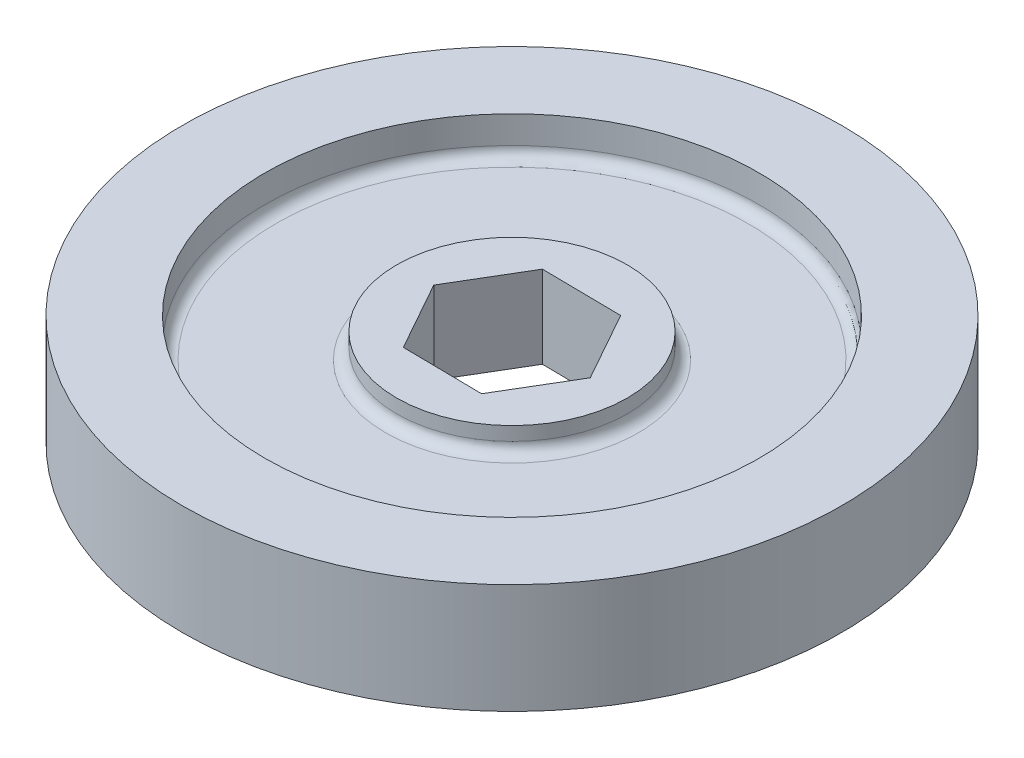
ISO-10303-21;
HEADER;
FILE_DESCRIPTION(('STEP AP214'),'2;1');
FILE_NAME('part.step','',(''),(''),'','','');
FILE_SCHEMA(('AUTOMOTIVE_DESIGN { 1 0 10303 214 1 1 1 1 }'));
ENDSEC;
DATA;
#1=APPLICATION_CONTEXT('core data for automotive mechanical design processes');
#2=APPLICATION_PROTOCOL_DEFINITION('international standard','automotive_design',2000,#1);
#3=PRODUCT_CONTEXT('',#1,'mechanical');
#4=PRODUCT('Part','Part','',(#3));
#5=PRODUCT_RELATED_PRODUCT_CATEGORY('part','',(#4));
#6=PRODUCT_DEFINITION_FORMATION('','',#4);
#7=PRODUCT_DEFINITION_CONTEXT('part definition',#1,'design');
#8=PRODUCT_DEFINITION('design','',#6,#7);
#9=PRODUCT_DEFINITION_SHAPE('','',#8);
#10=(LENGTH_UNIT() NAMED_UNIT(*) SI_UNIT(.MILLI.,.METRE.));
#11=(NAMED_UNIT(*) PLANE_ANGLE_UNIT() SI_UNIT($,.RADIAN.));
#12=(NAMED_UNIT(*) SI_UNIT($,.STERADIAN.) SOLID_ANGLE_UNIT());
#13=UNCERTAINTY_MEASURE_WITH_UNIT(LENGTH_MEASURE(1.E-05),#10,'distance_accuracy_value','');
#14=(GEOMETRIC_REPRESENTATION_CONTEXT(3) GLOBAL_UNCERTAINTY_ASSIGNED_CONTEXT((#13)) GLOBAL_UNIT_ASSIGNED_CONTEXT((#10,
#11,#12)) REPRESENTATION_CONTEXT('',''));
#15=CARTESIAN_POINT('',(0.,0.,0.));
#16=DIRECTION('',(0.,0.,1.));
#17=DIRECTION('',(1.,0.,0.));
#18=AXIS2_PLACEMENT_3D('',#15,#16,#17);
#19=CARTESIAN_POINT('',(0.,10.,0.));
#20=DIRECTION('',(0.,-1.,0.));
#21=DIRECTION('',(0.,0.,-1.));
#22=AXIS2_PLACEMENT_3D('',#19,#20,#21);
#23=CYLINDRICAL_SURFACE('',#22,30.);
#24=CARTESIAN_POINT('',(0.,10.,0.));
#25=DIRECTION('',(0.,1.,0.));
#26=DIRECTION('',(0.,0.,1.));
#27=AXIS2_PLACEMENT_3D('',#24,#25,#26);
#28=CIRCLE('',#27,30.);
#29=CARTESIAN_POINT('',(0.,10.,30.));
#30=VERTEX_POINT('',#29);
#31=EDGE_CURVE('E128',#30,#30,#28,.T.);
#32=ORIENTED_EDGE('',*,*,#31,.F.);
#33=EDGE_LOOP('',(#32));
#34=FACE_BOUND('',#33,.T.);
#35=CARTESIAN_POINT('',(0.,0.,0.));
#36=DIRECTION('',(0.,1.,0.));
#37=DIRECTION('',(0.,0.,1.));
#38=AXIS2_PLACEMENT_3D('',#35,#36,#37);
#39=CIRCLE('',#38,30.);
#40=CARTESIAN_POINT('',(0.,0.,30.));
#41=VERTEX_POINT('',#40);
#42=EDGE_CURVE('E127',#41,#41,#39,.T.);
#43=ORIENTED_EDGE('',*,*,#42,.T.);
#44=EDGE_LOOP('',(#43));
#45=FACE_BOUND('',#44,.T.);
#46=ADVANCED_FACE('F33',(#34,#45),#23,.T.);
#47=CARTESIAN_POINT('',(0.,10.,0.));
#48=DIRECTION('',(0.,1.,0.));
#49=DIRECTION('',(0.,0.,1.));
#50=AXIS2_PLACEMENT_3D('',#47,#48,#49);
#51=PLANE('',#50);
#52=CARTESIAN_POINT('',(0.,10.,0.));
#53=DIRECTION('',(0.,1.,0.));
#54=DIRECTION('',(0.,0.,1.));
#55=AXIS2_PLACEMENT_3D('',#52,#53,#54);
#56=CIRCLE('',#55,22.5);
#57=CARTESIAN_POINT('',(0.,10.,22.5));
#58=VERTEX_POINT('',#57);
#59=EDGE_CURVE('E124',#58,#58,#56,.T.);
#60=ORIENTED_EDGE('',*,*,#59,.F.);
#61=EDGE_LOOP('',(#60));
#62=FACE_BOUND('',#61,.T.);
#63=ORIENTED_EDGE('',*,*,#31,.T.);
#64=EDGE_LOOP('',(#63));
#65=FACE_BOUND('',#64,.T.);
#66=ADVANCED_FACE('F177',(#62,#65),#51,.T.);
#67=CARTESIAN_POINT('',(0.,0.,0.));
#68=DIRECTION('',(0.,1.,0.));
#69=DIRECTION('',(0.,0.,1.));
#70=AXIS2_PLACEMENT_3D('',#67,#68,#69);
#71=PLANE('',#70);
#72=CARTESIAN_POINT('',(0.,0.,0.));
#73=DIRECTION('',(0.,-1.,0.));
#74=DIRECTION('',(0.,0.,-1.));
#75=AXIS2_PLACEMENT_3D('',#72,#73,#74);
#76=CIRCLE('',#75,22.5);
#77=CARTESIAN_POINT('',(0.,0.,-22.5));
#78=VERTEX_POINT('',#77);
#79=EDGE_CURVE('E121',#78,#78,#76,.T.);
#80=ORIENTED_EDGE('',*,*,#79,.F.);
#81=EDGE_LOOP('',(#80));
#82=FACE_BOUND('',#81,.T.);
#83=ORIENTED_EDGE('',*,*,#42,.F.);
#84=EDGE_LOOP('',(#83));
#85=FACE_BOUND('',#84,.T.);
#86=ADVANCED_FACE('F183',(#82,#85),#71,.F.);
#87=CARTESIAN_POINT('',(0.,6.5,0.));
#88=DIRECTION('',(0.,1.,0.));
#89=DIRECTION('',(0.,0.,1.));
#90=AXIS2_PLACEMENT_3D('',#87,#88,#89);
#91=CYLINDRICAL_SURFACE('',#90,22.5);
#92=CARTESIAN_POINT('',(0.,7.5,0.));
#93=DIRECTION('',(0.,1.,0.));
#94=DIRECTION('',(0.,0.,1.));
#95=AXIS2_PLACEMENT_3D('',#92,#93,#94);
#96=CIRCLE('',#95,22.5);
#97=CARTESIAN_POINT('',(0.,7.5,22.5));
#98=VERTEX_POINT('',#97);
#99=EDGE_CURVE('E153',#98,#98,#96,.F.);
#100=ORIENTED_EDGE('',*,*,#99,.T.);
#101=EDGE_LOOP('',(#100));
#102=FACE_BOUND('',#101,.T.);
#103=ORIENTED_EDGE('',*,*,#59,.T.);
#104=EDGE_LOOP('',(#103));
#105=FACE_BOUND('',#104,.T.);
#106=ADVANCED_FACE('F205',(#102,#105),#91,.F.);
#107=CARTESIAN_POINT('',(0.,6.5,0.));
#108=DIRECTION('',(0.,1.,0.));
#109=DIRECTION('',(0.,0.,1.));
#110=AXIS2_PLACEMENT_3D('',#107,#108,#109);
#111=PLANE('',#110);
#112=CARTESIAN_POINT('',(0.,6.5,0.));
#113=DIRECTION('',(0.,1.,0.));
#114=DIRECTION('',(0.,0.,1.));
#115=AXIS2_PLACEMENT_3D('',#112,#113,#114);
#116=CIRCLE('',#115,11.5);
#117=CARTESIAN_POINT('',(0.,6.5,11.5));
#118=VERTEX_POINT('',#117);
#119=EDGE_CURVE('E11',#118,#118,#116,.F.);
#120=ORIENTED_EDGE('',*,*,#119,.T.);
#121=EDGE_LOOP('',(#120));
#122=FACE_BOUND('',#121,.T.);
#123=CARTESIAN_POINT('',(0.,6.5,0.));
#124=DIRECTION('',(0.,1.,0.));
#125=DIRECTION('',(0.,0.,1.));
#126=AXIS2_PLACEMENT_3D('',#123,#124,#125);
#127=CIRCLE('',#126,21.5);
#128=CARTESIAN_POINT('',(0.,6.5,21.5));
#129=VERTEX_POINT('',#128);
#130=EDGE_CURVE('E150',#129,#129,#127,.T.);
#131=ORIENTED_EDGE('',*,*,#130,.T.);
#132=EDGE_LOOP('',(#131));
#133=FACE_BOUND('',#132,.T.);
#134=ADVANCED_FACE('F202',(#122,#133),#111,.T.);
#135=CARTESIAN_POINT('',(0.,3.5,0.));
#136=DIRECTION('',(0.,-1.,0.));
#137=DIRECTION('',(0.,0.,-1.));
#138=AXIS2_PLACEMENT_3D('',#135,#136,#137);
#139=CYLINDRICAL_SURFACE('',#138,22.5);
#140=CARTESIAN_POINT('',(0.,2.5,0.));
#141=DIRECTION('',(0.,-1.,0.));
#142=DIRECTION('',(0.,0.,-1.));
#143=AXIS2_PLACEMENT_3D('',#140,#141,#142);
#144=CIRCLE('',#143,22.5);
#145=CARTESIAN_POINT('',(0.,2.5,-22.5));
#146=VERTEX_POINT('',#145);
#147=EDGE_CURVE('E147',#146,#146,#144,.F.);
#148=ORIENTED_EDGE('',*,*,#147,.T.);
#149=EDGE_LOOP('',(#148));
#150=FACE_BOUND('',#149,.T.);
#151=ORIENTED_EDGE('',*,*,#79,.T.);
#152=EDGE_LOOP('',(#151));
#153=FACE_BOUND('',#152,.T.);
#154=ADVANCED_FACE('F204',(#150,#153),#139,.F.);
#155=CARTESIAN_POINT('',(0.,3.5,0.));
#156=DIRECTION('',(0.,-1.,0.));
#157=DIRECTION('',(0.,0.,-1.));
#158=AXIS2_PLACEMENT_3D('',#155,#156,#157);
#159=PLANE('',#158);
#160=CARTESIAN_POINT('',(0.,3.5,0.));
#161=DIRECTION('',(0.,-1.,0.));
#162=DIRECTION('',(0.,0.,-1.));
#163=AXIS2_PLACEMENT_3D('',#160,#161,#162);
#164=CIRCLE('',#163,11.5);
#165=CARTESIAN_POINT('',(0.,3.5,-11.5));
#166=VERTEX_POINT('',#165);
#167=EDGE_CURVE('E159',#166,#166,#164,.F.);
#168=ORIENTED_EDGE('',*,*,#167,.T.);
#169=EDGE_LOOP('',(#168));
#170=FACE_BOUND('',#169,.T.);
#171=CARTESIAN_POINT('',(0.,3.5,0.));
#172=DIRECTION('',(0.,-1.,0.));
#173=DIRECTION('',(0.,0.,-1.));
#174=AXIS2_PLACEMENT_3D('',#171,#172,#173);
#175=CIRCLE('',#174,21.5);
#176=CARTESIAN_POINT('',(0.,3.5,-21.5));
#177=VERTEX_POINT('',#176);
#178=EDGE_CURVE('E144',#177,#177,#175,.T.);
#179=ORIENTED_EDGE('',*,*,#178,.T.);
#180=EDGE_LOOP('',(#179));
#181=FACE_BOUND('',#180,.T.);
#182=ADVANCED_FACE('F212',(#170,#181),#159,.T.);
#183=CARTESIAN_POINT('',(0.,8.75,0.));
#184=DIRECTION('',(0.,-1.,0.));
#185=DIRECTION('',(0.,0.,-1.));
#186=AXIS2_PLACEMENT_3D('',#183,#184,#185);
#187=CYLINDRICAL_SURFACE('',#186,10.5);
#188=CARTESIAN_POINT('',(0.,7.5,0.));
#189=DIRECTION('',(0.,1.,0.));
#190=DIRECTION('',(0.,0.,1.));
#191=AXIS2_PLACEMENT_3D('',#188,#189,#190);
#192=CIRCLE('',#191,10.5);
#193=CARTESIAN_POINT('',(0.,7.5,10.5));
#194=VERTEX_POINT('',#193);
#195=EDGE_CURVE('E41',#194,#194,#192,.T.);
#196=ORIENTED_EDGE('',*,*,#195,.T.);
#197=EDGE_LOOP('',(#196));
#198=FACE_BOUND('',#197,.T.);
#199=CARTESIAN_POINT('',(0.,8.75,0.));
#200=DIRECTION('',(0.,1.,0.));
#201=DIRECTION('',(0.,0.,1.));
#202=AXIS2_PLACEMENT_3D('',#199,#200,#201);
#203=CIRCLE('',#202,10.5);
#204=CARTESIAN_POINT('',(0.,8.75,10.5));
#205=VERTEX_POINT('',#204);
#206=EDGE_CURVE('E118',#205,#205,#203,.T.);
#207=ORIENTED_EDGE('',*,*,#206,.F.);
#208=EDGE_LOOP('',(#207));
#209=FACE_BOUND('',#208,.T.);
#210=ADVANCED_FACE('F164',(#198,#209),#187,.T.);
#211=CARTESIAN_POINT('',(0.,8.75,0.));
#212=DIRECTION('',(0.,1.,0.));
#213=DIRECTION('',(0.,0.,1.));
#214=AXIS2_PLACEMENT_3D('',#211,#212,#213);
#215=PLANE('',#214);
#216=DIRECTION('',(-0.48866357112851,0.,-0.872472299991199));
#217=VECTOR('',#216,1.);
#218=CARTESIAN_POINT('',(5.45295187494499,8.75,-3.05414731955318));
#219=LINE('',#218,#217);
#220=CARTESIAN_POINT('',(7.2162646520338,8.75,0.0941159133243871));
#221=VERTEX_POINT('',#220);
#222=CARTESIAN_POINT('',(3.68963909785619,8.75,-6.20241055243075));
#223=VERTEX_POINT('',#222);
#224=EDGE_CURVE('E113',#221,#223,#219,.T.);
#225=ORIENTED_EDGE('',*,*,#224,.F.);
#226=DIRECTION('',(0.511251390326361,0.,-0.859431216496913));
#227=VECTOR('',#226,1.);
#228=CARTESIAN_POINT('',(5.3714451031057,8.75,3.19532118953976));
#229=LINE('',#228,#227);
#230=CARTESIAN_POINT('',(3.52662555417761,8.75,6.29652646575513));
#231=VERTEX_POINT('',#230);
#232=EDGE_CURVE('E111',#231,#221,#229,.T.);
#233=ORIENTED_EDGE('',*,*,#232,.F.);
#234=DIRECTION('',(0.99991496145487,0.,0.0130410834942862));
#235=VECTOR('',#234,1.);
#236=CARTESIAN_POINT('',(-0.081506771839289,8.75,6.24946850909294));
#237=LINE('',#236,#235);
#238=CARTESIAN_POINT('',(-3.68963909785619,8.75,6.20241055243075));
#239=VERTEX_POINT('',#238);
#240=EDGE_CURVE('E106',#239,#231,#237,.T.);
#241=ORIENTED_EDGE('',*,*,#240,.F.);
#242=DIRECTION('',(0.488663571128509,0.,0.872472299991199));
#243=VECTOR('',#242,1.);
#244=CARTESIAN_POINT('',(-5.45295187494499,8.75,3.05414731955318));
#245=LINE('',#244,#243);
#246=CARTESIAN_POINT('',(-7.2162646520338,8.75,-0.0941159133243836));
#247=VERTEX_POINT('',#246);
#248=EDGE_CURVE('E104',#247,#239,#245,.T.);
#249=ORIENTED_EDGE('',*,*,#248,.F.);
#250=DIRECTION('',(-0.511251390326361,0.,0.859431216496913));
#251=VECTOR('',#250,1.);
#252=CARTESIAN_POINT('',(-5.3714451031057,8.75,-3.19532118953976));
#253=LINE('',#252,#251);
#254=CARTESIAN_POINT('',(-3.52662555417761,8.75,-6.29652646575513));
#255=VERTEX_POINT('',#254);
#256=EDGE_CURVE('E88',#255,#247,#253,.T.);
#257=ORIENTED_EDGE('',*,*,#256,.F.);
#258=DIRECTION('',(-0.99991496145487,0.,-0.0130410834942866));
#259=VECTOR('',#258,1.);
#260=CARTESIAN_POINT('',(0.0815067718392913,8.75,-6.24946850909294));
#261=LINE('',#260,#259);
#262=EDGE_CURVE('E83',#223,#255,#261,.T.);
#263=ORIENTED_EDGE('',*,*,#262,.F.);
#264=EDGE_LOOP('',(#225,#233,#241,#249,#257,#263));
#265=FACE_BOUND('',#264,.T.);
#266=ORIENTED_EDGE('',*,*,#206,.T.);
#267=EDGE_LOOP('',(#266));
#268=FACE_BOUND('',#267,.T.);
#269=ADVANCED_FACE('F101',(#265,#268),#215,.T.);
#270=CARTESIAN_POINT('',(0.,1.25,0.));
#271=DIRECTION('',(0.,1.,0.));
#272=DIRECTION('',(0.,0.,1.));
#273=AXIS2_PLACEMENT_3D('',#270,#271,#272);
#274=CYLINDRICAL_SURFACE('',#273,10.5);
#275=CARTESIAN_POINT('',(0.,2.5,0.));
#276=DIRECTION('',(0.,-1.,0.));
#277=DIRECTION('',(0.,0.,-1.));
#278=AXIS2_PLACEMENT_3D('',#275,#276,#277);
#279=CIRCLE('',#278,10.5);
#280=CARTESIAN_POINT('',(0.,2.5,-10.5));
#281=VERTEX_POINT('',#280);
#282=EDGE_CURVE('E156',#281,#281,#279,.T.);
#283=ORIENTED_EDGE('',*,*,#282,.T.);
#284=EDGE_LOOP('',(#283));
#285=FACE_BOUND('',#284,.T.);
#286=CARTESIAN_POINT('',(0.,1.25,0.));
#287=DIRECTION('',(0.,-1.,0.));
#288=DIRECTION('',(0.,0.,-1.));
#289=AXIS2_PLACEMENT_3D('',#286,#287,#288);
#290=CIRCLE('',#289,10.5);
#291=CARTESIAN_POINT('',(0.,1.25,-10.5));
#292=VERTEX_POINT('',#291);
#293=EDGE_CURVE('E115',#292,#292,#290,.T.);
#294=ORIENTED_EDGE('',*,*,#293,.F.);
#295=EDGE_LOOP('',(#294));
#296=FACE_BOUND('',#295,.T.);
#297=ADVANCED_FACE('F225',(#285,#296),#274,.T.);
#298=CARTESIAN_POINT('',(0.,1.25,0.));
#299=DIRECTION('',(0.,-1.,0.));
#300=DIRECTION('',(0.,0.,-1.));
#301=AXIS2_PLACEMENT_3D('',#298,#299,#300);
#302=PLANE('',#301);
#303=DIRECTION('',(0.48866357112851,0.,0.872472299991199));
#304=VECTOR('',#303,1.);
#305=CARTESIAN_POINT('',(5.45295187494499,1.25,-3.05414731955318));
#306=LINE('',#305,#304);
#307=CARTESIAN_POINT('',(3.68963909785619,1.25,-6.20241055243075));
#308=VERTEX_POINT('',#307);
#309=CARTESIAN_POINT('',(7.2162646520338,1.25,0.0941159133243871));
#310=VERTEX_POINT('',#309);
#311=EDGE_CURVE('E142',#308,#310,#306,.T.);
#312=ORIENTED_EDGE('',*,*,#311,.F.);
#313=DIRECTION('',(0.99991496145487,0.,0.0130410834942866));
#314=VECTOR('',#313,1.);
#315=CARTESIAN_POINT('',(0.0815067718392913,1.25,-6.24946850909294));
#316=LINE('',#315,#314);
#317=CARTESIAN_POINT('',(-3.52662555417761,1.25,-6.29652646575513));
#318=VERTEX_POINT('',#317);
#319=EDGE_CURVE('E131',#318,#308,#316,.T.);
#320=ORIENTED_EDGE('',*,*,#319,.F.);
#321=DIRECTION('',(0.511251390326361,0.,-0.859431216496913));
#322=VECTOR('',#321,1.);
#323=CARTESIAN_POINT('',(-5.3714451031057,1.25,-3.19532118953976));
#324=LINE('',#323,#322);
#325=CARTESIAN_POINT('',(-7.2162646520338,1.25,-0.0941159133243836));
#326=VERTEX_POINT('',#325);
#327=EDGE_CURVE('E96',#326,#318,#324,.T.);
#328=ORIENTED_EDGE('',*,*,#327,.F.);
#329=DIRECTION('',(-0.488663571128509,0.,-0.872472299991199));
#330=VECTOR('',#329,1.);
#331=CARTESIAN_POINT('',(-5.45295187494499,1.25,3.05414731955318));
#332=LINE('',#331,#330);
#333=CARTESIAN_POINT('',(-3.68963909785619,1.25,6.20241055243075));
#334=VERTEX_POINT('',#333);
#335=EDGE_CURVE('E136',#334,#326,#332,.T.);
#336=ORIENTED_EDGE('',*,*,#335,.F.);
#337=DIRECTION('',(-0.99991496145487,0.,-0.0130410834942862));
#338=VECTOR('',#337,1.);
#339=CARTESIAN_POINT('',(-0.081506771839289,1.25,6.24946850909294));
#340=LINE('',#339,#338);
#341=CARTESIAN_POINT('',(3.52662555417761,1.25,6.29652646575513));
#342=VERTEX_POINT('',#341);
#343=EDGE_CURVE('E138',#342,#334,#340,.T.);
#344=ORIENTED_EDGE('',*,*,#343,.F.);
#345=DIRECTION('',(-0.511251390326361,0.,0.859431216496913));
#346=VECTOR('',#345,1.);
#347=CARTESIAN_POINT('',(5.3714451031057,1.25,3.19532118953976));
#348=LINE('',#347,#346);
#349=EDGE_CURVE('E140',#310,#342,#348,.T.);
#350=ORIENTED_EDGE('',*,*,#349,.F.);
#351=EDGE_LOOP('',(#312,#320,#328,#336,#344,#350));
#352=FACE_BOUND('',#351,.T.);
#353=ORIENTED_EDGE('',*,*,#293,.T.);
#354=EDGE_LOOP('',(#353));
#355=FACE_BOUND('',#354,.T.);
#356=ADVANCED_FACE('F228',(#352,#355),#302,.T.);
#357=CARTESIAN_POINT('',(7.2162646520338,0.,0.0941159133243871));
#358=DIRECTION('',(0.872472299991198,0.,-0.48866357112851));
#359=DIRECTION('',(-0.48866357112851,0.,-0.872472299991199));
#360=AXIS2_PLACEMENT_3D('',#357,#358,#359);
#361=PLANE('',#360);
#362=ORIENTED_EDGE('',*,*,#224,.T.);
#363=DIRECTION('',(0.,1.,0.));
#364=VECTOR('',#363,1.);
#365=CARTESIAN_POINT('',(3.68963909785619,0.,-6.20241055243075));
#366=LINE('',#365,#364);
#367=EDGE_CURVE('E48',#308,#223,#366,.T.);
#368=ORIENTED_EDGE('',*,*,#367,.F.);
#369=ORIENTED_EDGE('',*,*,#311,.T.);
#370=DIRECTION('',(0.,1.,0.));
#371=VECTOR('',#370,1.);
#372=CARTESIAN_POINT('',(7.2162646520338,0.,0.0941159133243871));
#373=LINE('',#372,#371);
#374=EDGE_CURVE('E89',#310,#221,#373,.T.);
#375=ORIENTED_EDGE('',*,*,#374,.T.);
#376=EDGE_LOOP('',(#362,#368,#369,#375));
#377=FACE_BOUND('',#376,.T.);
#378=ADVANCED_FACE('F232',(#377),#361,.F.);
#379=CARTESIAN_POINT('',(3.52662555417761,0.,6.29652646575513));
#380=DIRECTION('',(0.859431216496912,0.,0.511251390326361));
#381=DIRECTION('',(0.511251390326361,0.,-0.859431216496913));
#382=AXIS2_PLACEMENT_3D('',#379,#380,#381);
#383=PLANE('',#382);
#384=ORIENTED_EDGE('',*,*,#232,.T.);
#385=ORIENTED_EDGE('',*,*,#374,.F.);
#386=ORIENTED_EDGE('',*,*,#349,.T.);
#387=DIRECTION('',(0.,1.,0.));
#388=VECTOR('',#387,1.);
#389=CARTESIAN_POINT('',(3.52662555417761,0.,6.29652646575513));
#390=LINE('',#389,#388);
#391=EDGE_CURVE('E260',#342,#231,#390,.T.);
#392=ORIENTED_EDGE('',*,*,#391,.T.);
#393=EDGE_LOOP('',(#384,#385,#386,#392));
#394=FACE_BOUND('',#393,.T.);
#395=ADVANCED_FACE('F236',(#394),#383,.F.);
#396=CARTESIAN_POINT('',(-3.68963909785619,0.,6.20241055243075));
#397=DIRECTION('',(-0.0130410834942862,0.,0.99991496145487));
#398=DIRECTION('',(0.99991496145487,0.,0.0130410834942862));
#399=AXIS2_PLACEMENT_3D('',#396,#397,#398);
#400=PLANE('',#399);
#401=ORIENTED_EDGE('',*,*,#240,.T.);
#402=ORIENTED_EDGE('',*,*,#391,.F.);
#403=ORIENTED_EDGE('',*,*,#343,.T.);
#404=DIRECTION('',(0.,1.,0.));
#405=VECTOR('',#404,1.);
#406=CARTESIAN_POINT('',(-3.68963909785619,0.,6.20241055243075));
#407=LINE('',#406,#405);
#408=EDGE_CURVE('E263',#334,#239,#407,.T.);
#409=ORIENTED_EDGE('',*,*,#408,.T.);
#410=EDGE_LOOP('',(#401,#402,#403,#409));
#411=FACE_BOUND('',#410,.T.);
#412=ADVANCED_FACE('F245',(#411),#400,.F.);
#413=CARTESIAN_POINT('',(-7.2162646520338,0.,-0.0941159133243836));
#414=DIRECTION('',(-0.872472299991199,0.,0.488663571128509));
#415=DIRECTION('',(0.488663571128509,0.,0.872472299991199));
#416=AXIS2_PLACEMENT_3D('',#413,#414,#415);
#417=PLANE('',#416);
#418=ORIENTED_EDGE('',*,*,#248,.T.);
#419=ORIENTED_EDGE('',*,*,#408,.F.);
#420=ORIENTED_EDGE('',*,*,#335,.T.);
#421=DIRECTION('',(0.,1.,0.));
#422=VECTOR('',#421,1.);
#423=CARTESIAN_POINT('',(-7.2162646520338,0.,-0.0941159133243836));
#424=LINE('',#423,#422);
#425=EDGE_CURVE('E98',#326,#247,#424,.T.);
#426=ORIENTED_EDGE('',*,*,#425,.T.);
#427=EDGE_LOOP('',(#418,#419,#420,#426));
#428=FACE_BOUND('',#427,.T.);
#429=ADVANCED_FACE('F242',(#428),#417,.F.);
#430=CARTESIAN_POINT('',(-3.52662555417761,0.,-6.29652646575513));
#431=DIRECTION('',(-0.859431216496912,0.,-0.511251390326361));
#432=DIRECTION('',(-0.511251390326361,0.,0.859431216496913));
#433=AXIS2_PLACEMENT_3D('',#430,#431,#432);
#434=PLANE('',#433);
#435=ORIENTED_EDGE('',*,*,#256,.T.);
#436=ORIENTED_EDGE('',*,*,#425,.F.);
#437=ORIENTED_EDGE('',*,*,#327,.T.);
#438=DIRECTION('',(0.,1.,0.));
#439=VECTOR('',#438,1.);
#440=CARTESIAN_POINT('',(-3.52662555417761,0.,-6.29652646575513));
#441=LINE('',#440,#439);
#442=EDGE_CURVE('E53',#318,#255,#441,.T.);
#443=ORIENTED_EDGE('',*,*,#442,.T.);
#444=EDGE_LOOP('',(#435,#436,#437,#443));
#445=FACE_BOUND('',#444,.T.);
#446=ADVANCED_FACE('F92',(#445),#434,.F.);
#447=CARTESIAN_POINT('',(3.68963909785619,0.,-6.20241055243075));
#448=DIRECTION('',(0.0130410834942866,0.,-0.99991496145487));
#449=DIRECTION('',(-0.99991496145487,0.,-0.0130410834942866));
#450=AXIS2_PLACEMENT_3D('',#447,#448,#449);
#451=PLANE('',#450);
#452=ORIENTED_EDGE('',*,*,#262,.T.);
#453=ORIENTED_EDGE('',*,*,#442,.F.);
#454=ORIENTED_EDGE('',*,*,#319,.T.);
#455=ORIENTED_EDGE('',*,*,#367,.T.);
#456=EDGE_LOOP('',(#452,#453,#454,#455));
#457=FACE_BOUND('',#456,.T.);
#458=ADVANCED_FACE('F84',(#457),#451,.F.);
#459=CARTESIAN_POINT('',(0.,2.5,0.));
#460=DIRECTION('',(0.,-1.,0.));
#461=DIRECTION('',(0.,0.,-1.));
#462=AXIS2_PLACEMENT_3D('',#459,#460,#461);
#463=TOROIDAL_SURFACE('',#462,21.5,1.);
#464=ORIENTED_EDGE('',*,*,#147,.F.);
#465=EDGE_LOOP('',(#464));
#466=FACE_BOUND('',#465,.T.);
#467=ORIENTED_EDGE('',*,*,#178,.F.);
#468=EDGE_LOOP('',(#467));
#469=FACE_BOUND('',#468,.T.);
#470=ADVANCED_FACE('F190',(#466,#469),#463,.F.);
#471=CARTESIAN_POINT('',(0.,7.5,0.));
#472=DIRECTION('',(0.,1.,0.));
#473=DIRECTION('',(0.,0.,1.));
#474=AXIS2_PLACEMENT_3D('',#471,#472,#473);
#475=TOROIDAL_SURFACE('',#474,21.5,1.);
#476=ORIENTED_EDGE('',*,*,#99,.F.);
#477=EDGE_LOOP('',(#476));
#478=FACE_BOUND('',#477,.T.);
#479=ORIENTED_EDGE('',*,*,#130,.F.);
#480=EDGE_LOOP('',(#479));
#481=FACE_BOUND('',#480,.T.);
#482=ADVANCED_FACE('F173',(#478,#481),#475,.F.);
#483=CARTESIAN_POINT('',(0.,2.5,0.));
#484=DIRECTION('',(0.,-1.,0.));
#485=DIRECTION('',(0.,0.,-1.));
#486=AXIS2_PLACEMENT_3D('',#483,#484,#485);
#487=TOROIDAL_SURFACE('',#486,11.5,1.);
#488=ORIENTED_EDGE('',*,*,#167,.F.);
#489=EDGE_LOOP('',(#488));
#490=FACE_BOUND('',#489,.T.);
#491=ORIENTED_EDGE('',*,*,#282,.F.);
#492=EDGE_LOOP('',(#491));
#493=FACE_BOUND('',#492,.T.);
#494=ADVANCED_FACE('F168',(#490,#493),#487,.F.);
#495=CARTESIAN_POINT('',(0.,7.5,0.));
#496=DIRECTION('',(0.,1.,0.));
#497=DIRECTION('',(0.,0.,1.));
#498=AXIS2_PLACEMENT_3D('',#495,#496,#497);
#499=TOROIDAL_SURFACE('',#498,11.5,1.);
#500=ORIENTED_EDGE('',*,*,#119,.F.);
#501=EDGE_LOOP('',(#500));
#502=FACE_BOUND('',#501,.T.);
#503=ORIENTED_EDGE('',*,*,#195,.F.);
#504=EDGE_LOOP('',(#503));
#505=FACE_BOUND('',#504,.T.);
#506=ADVANCED_FACE('F35',(#502,#505),#499,.F.);
#507=CLOSED_SHELL('',(#46,#66,#86,#106,#134,#154,#182,#210,#269,#297,#356,#378,#395,#412,#429,
#446,#458,#470,#482,#494,#506));
#508=MANIFOLD_SOLID_BREP('B2',#507);
#509=ADVANCED_BREP_SHAPE_REPRESENTATION('',(#18,#508),#14);
#510=SHAPE_DEFINITION_REPRESENTATION(#9,#509);
ENDSEC;
END-ISO-10303-21;
